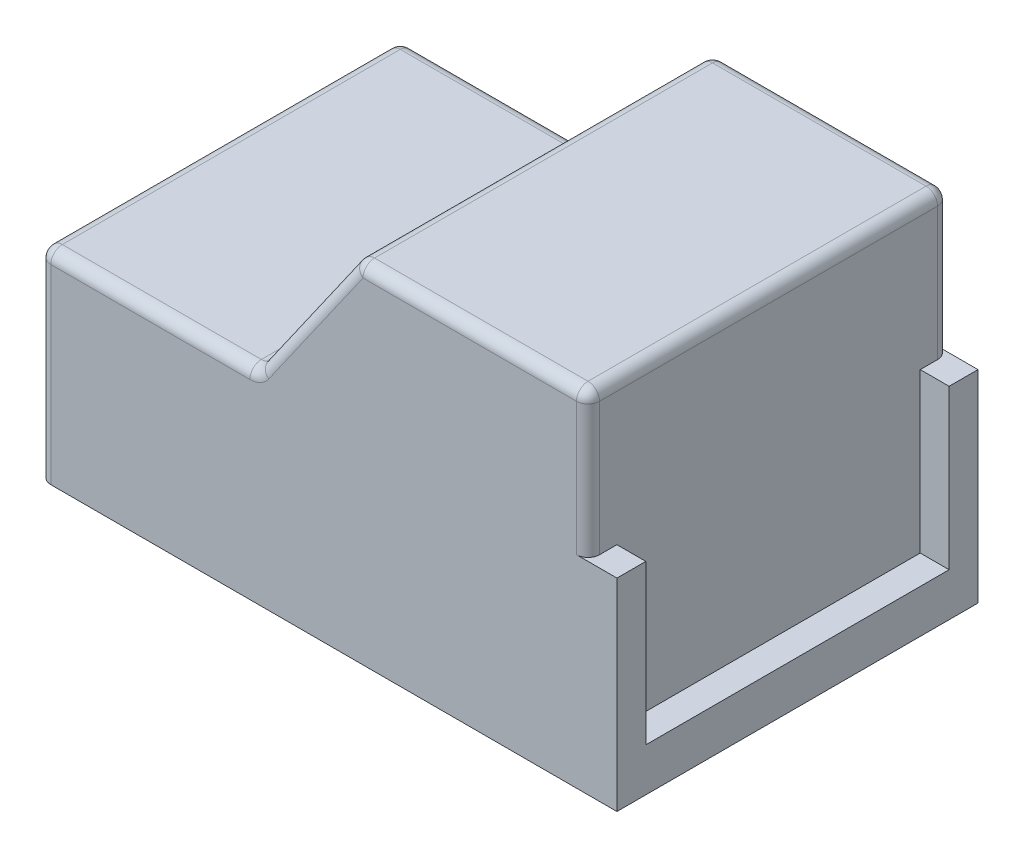
ISO-10303-21;
HEADER;
FILE_DESCRIPTION(('STEP AP214'),'2;1');
FILE_NAME('part.step','',(''),(''),'','','');
FILE_SCHEMA(('AUTOMOTIVE_DESIGN { 1 0 10303 214 1 1 1 1 }'));
ENDSEC;
DATA;
#1=APPLICATION_CONTEXT('core data for automotive mechanical design processes');
#2=APPLICATION_PROTOCOL_DEFINITION('international standard','automotive_design',2000,#1);
#3=PRODUCT_CONTEXT('',#1,'mechanical');
#4=PRODUCT('Part','Part','',(#3));
#5=PRODUCT_RELATED_PRODUCT_CATEGORY('part','',(#4));
#6=PRODUCT_DEFINITION_FORMATION('','',#4);
#7=PRODUCT_DEFINITION_CONTEXT('part definition',#1,'design');
#8=PRODUCT_DEFINITION('design','',#6,#7);
#9=PRODUCT_DEFINITION_SHAPE('','',#8);
#10=(LENGTH_UNIT() NAMED_UNIT(*) SI_UNIT(.MILLI.,.METRE.));
#11=(NAMED_UNIT(*) PLANE_ANGLE_UNIT() SI_UNIT($,.RADIAN.));
#12=(NAMED_UNIT(*) SI_UNIT($,.STERADIAN.) SOLID_ANGLE_UNIT());
#13=UNCERTAINTY_MEASURE_WITH_UNIT(LENGTH_MEASURE(1.E-05),#10,'distance_accuracy_value','');
#14=(GEOMETRIC_REPRESENTATION_CONTEXT(3) GLOBAL_UNCERTAINTY_ASSIGNED_CONTEXT((#13)) GLOBAL_UNIT_ASSIGNED_CONTEXT((#10,
#11,#12)) REPRESENTATION_CONTEXT('',''));
#15=CARTESIAN_POINT('',(0.,0.,0.));
#16=DIRECTION('',(0.,0.,1.));
#17=DIRECTION('',(1.,0.,0.));
#18=AXIS2_PLACEMENT_3D('',#15,#16,#17);
#19=CARTESIAN_POINT('',(101.6,88.9,158.75));
#20=DIRECTION('',(0.,-1.,0.));
#21=DIRECTION('',(1.,0.,0.));
#22=AXIS2_PLACEMENT_3D('',#19,#20,#21);
#23=PLANE('',#22);
#24=DIRECTION('',(0.,0.,-1.));
#25=VECTOR('',#24,1.);
#26=CARTESIAN_POINT('',(101.6,88.9,158.75));
#27=LINE('',#26,#25);
#28=CARTESIAN_POINT('',(101.6,88.9,158.75));
#29=VERTEX_POINT('',#28);
#30=CARTESIAN_POINT('',(101.6,88.8999999999999,133.35));
#31=VERTEX_POINT('',#30);
#32=EDGE_CURVE('E254',#29,#31,#27,.T.);
#33=ORIENTED_EDGE('',*,*,#32,.T.);
#34=DIRECTION('',(1.,0.,0.));
#35=VECTOR('',#34,1.);
#36=CARTESIAN_POINT('',(76.1999999999999,88.8999999999999,133.35));
#37=LINE('',#36,#35);
#38=CARTESIAN_POINT('',(76.1999999999999,88.8999999999999,133.35));
#39=VERTEX_POINT('',#38);
#40=EDGE_CURVE('E226',#39,#31,#37,.T.);
#41=ORIENTED_EDGE('',*,*,#40,.F.);
#42=DIRECTION('',(0.,0.,-1.));
#43=VECTOR('',#42,1.);
#44=CARTESIAN_POINT('',(76.1999999999999,88.8999999999999,158.75));
#45=LINE('',#44,#43);
#46=CARTESIAN_POINT('',(76.1999999999999,88.8999999999999,148.59));
#47=VERTEX_POINT('',#46);
#48=EDGE_CURVE('E252',#47,#39,#45,.T.);
#49=ORIENTED_EDGE('',*,*,#48,.F.);
#50=CARTESIAN_POINT('',(66.0399999999999,88.8999999999999,148.59));
#51=DIRECTION('',(0.,-1.,0.));
#52=DIRECTION('',(1.,0.,0.));
#53=AXIS2_PLACEMENT_3D('',#50,#51,#52);
#54=CIRCLE('',#53,10.16);
#55=CARTESIAN_POINT('',(66.0399999999999,88.8999999999999,158.75));
#56=VERTEX_POINT('',#55);
#57=EDGE_CURVE('E11',#47,#56,#54,.T.);
#58=ORIENTED_EDGE('',*,*,#57,.T.);
#59=DIRECTION('',(-1.,0.,0.));
#60=VECTOR('',#59,1.);
#61=CARTESIAN_POINT('',(101.6,88.9,158.75));
#62=LINE('',#61,#60);
#63=EDGE_CURVE('E243',#29,#56,#62,.T.);
#64=ORIENTED_EDGE('',*,*,#63,.F.);
#65=EDGE_LOOP('',(#33,#41,#49,#58,#64));
#66=FACE_BOUND('',#65,.T.);
#67=ADVANCED_FACE('F49',(#66),#23,.F.);
#68=CARTESIAN_POINT('',(-215.9,88.9,158.75));
#69=DIRECTION('',(0.,-1.,0.));
#70=DIRECTION('',(1.,0.,0.));
#71=AXIS2_PLACEMENT_3D('',#68,#69,#70);
#72=PLANE('',#71);
#73=DIRECTION('',(-1.,0.,0.));
#74=VECTOR('',#73,1.);
#75=CARTESIAN_POINT('',(-215.9,88.9,148.59));
#76=LINE('',#75,#74);
#77=CARTESIAN_POINT('',(-396.24,88.9,148.59));
#78=VERTEX_POINT('',#77);
#79=CARTESIAN_POINT('',(-221.188961233606,88.9,148.59));
#80=VERTEX_POINT('',#79);
#81=EDGE_CURVE('E304',#78,#80,#76,.F.);
#82=ORIENTED_EDGE('',*,*,#81,.T.);
#83=DIRECTION('',(0.,0.,-1.));
#84=VECTOR('',#83,1.);
#85=CARTESIAN_POINT('',(-221.188961233606,88.9,-158.75));
#86=LINE('',#85,#84);
#87=CARTESIAN_POINT('',(-221.188961233606,88.9,-148.59));
#88=VERTEX_POINT('',#87);
#89=EDGE_CURVE('E306',#80,#88,#86,.T.);
#90=ORIENTED_EDGE('',*,*,#89,.T.);
#91=DIRECTION('',(-1.,0.,0.));
#92=VECTOR('',#91,1.);
#93=CARTESIAN_POINT('',(-215.9,88.9,-148.59));
#94=LINE('',#93,#92);
#95=CARTESIAN_POINT('',(-396.24,88.9,-148.59));
#96=VERTEX_POINT('',#95);
#97=EDGE_CURVE('E300',#88,#96,#94,.T.);
#98=ORIENTED_EDGE('',*,*,#97,.T.);
#99=DIRECTION('',(0.,0.,-1.));
#100=VECTOR('',#99,1.);
#101=CARTESIAN_POINT('',(-396.24,88.9,158.75));
#102=LINE('',#101,#100);
#103=EDGE_CURVE('E302',#96,#78,#102,.F.);
#104=ORIENTED_EDGE('',*,*,#103,.T.);
#105=EDGE_LOOP('',(#82,#90,#98,#104));
#106=FACE_BOUND('',#105,.T.);
#107=ADVANCED_FACE('F507',(#106),#72,.F.);
#108=CARTESIAN_POINT('',(-406.4,88.9,158.75));
#109=DIRECTION('',(1.,0.,0.));
#110=DIRECTION('',(0.,0.,-1.));
#111=AXIS2_PLACEMENT_3D('',#108,#109,#110);
#112=PLANE('',#111);
#113=DIRECTION('',(0.,0.,-1.));
#114=VECTOR('',#113,1.);
#115=CARTESIAN_POINT('',(-406.4,78.74,158.75));
#116=LINE('',#115,#114);
#117=CARTESIAN_POINT('',(-406.4,78.74,148.59));
#118=VERTEX_POINT('',#117);
#119=CARTESIAN_POINT('',(-406.4,78.74,-148.59));
#120=VERTEX_POINT('',#119);
#121=EDGE_CURVE('E311',#118,#120,#116,.T.);
#122=ORIENTED_EDGE('',*,*,#121,.T.);
#123=DIRECTION('',(0.,-1.,0.));
#124=VECTOR('',#123,1.);
#125=CARTESIAN_POINT('',(-406.4,88.9,-148.59));
#126=LINE('',#125,#124);
#127=CARTESIAN_POINT('',(-406.4,-88.9,-148.59));
#128=VERTEX_POINT('',#127);
#129=EDGE_CURVE('E313',#120,#128,#126,.T.);
#130=ORIENTED_EDGE('',*,*,#129,.T.);
#131=DIRECTION('',(0.,0.,-1.));
#132=VECTOR('',#131,1.);
#133=CARTESIAN_POINT('',(-406.4,-88.9,158.75));
#134=LINE('',#133,#132);
#135=CARTESIAN_POINT('',(-406.4,-88.9,148.59));
#136=VERTEX_POINT('',#135);
#137=EDGE_CURVE('E260',#136,#128,#134,.T.);
#138=ORIENTED_EDGE('',*,*,#137,.F.);
#139=DIRECTION('',(0.,-1.,0.));
#140=VECTOR('',#139,1.);
#141=CARTESIAN_POINT('',(-406.4,88.9,148.59));
#142=LINE('',#141,#140);
#143=EDGE_CURVE('E309',#136,#118,#142,.F.);
#144=ORIENTED_EDGE('',*,*,#143,.T.);
#145=EDGE_LOOP('',(#122,#130,#138,#144));
#146=FACE_BOUND('',#145,.T.);
#147=ADVANCED_FACE('F511',(#146),#112,.F.);
#148=CARTESIAN_POINT('',(-406.4,-88.9,158.75));
#149=DIRECTION('',(0.,1.,0.));
#150=DIRECTION('',(0.,0.,1.));
#151=AXIS2_PLACEMENT_3D('',#148,#149,#150);
#152=PLANE('',#151);
#153=ORIENTED_EDGE('',*,*,#137,.T.);
#154=CARTESIAN_POINT('',(-396.24,-88.9,-148.59));
#155=DIRECTION('',(0.,1.,0.));
#156=DIRECTION('',(0.,0.,1.));
#157=AXIS2_PLACEMENT_3D('',#154,#155,#156);
#158=CIRCLE('',#157,10.16);
#159=CARTESIAN_POINT('',(-396.24,-88.9,-158.75));
#160=VERTEX_POINT('',#159);
#161=EDGE_CURVE('E330',#128,#160,#158,.F.);
#162=ORIENTED_EDGE('',*,*,#161,.T.);
#163=DIRECTION('',(1.,0.,0.));
#164=VECTOR('',#163,1.);
#165=CARTESIAN_POINT('',(-406.4,-88.9,-158.75));
#166=LINE('',#165,#164);
#167=CARTESIAN_POINT('',(101.6,-88.9,-158.75));
#168=VERTEX_POINT('',#167);
#169=EDGE_CURVE('E246',#160,#168,#166,.T.);
#170=ORIENTED_EDGE('',*,*,#169,.T.);
#171=DIRECTION('',(0.,0.,-1.));
#172=VECTOR('',#171,1.);
#173=CARTESIAN_POINT('',(101.6,-88.9,158.75));
#174=LINE('',#173,#172);
#175=CARTESIAN_POINT('',(101.6,-88.9,158.75));
#176=VERTEX_POINT('',#175);
#177=EDGE_CURVE('E257',#176,#168,#174,.T.);
#178=ORIENTED_EDGE('',*,*,#177,.F.);
#179=DIRECTION('',(1.,0.,0.));
#180=VECTOR('',#179,1.);
#181=CARTESIAN_POINT('',(-406.4,-88.9,158.75));
#182=LINE('',#181,#180);
#183=CARTESIAN_POINT('',(-396.24,-88.9,158.75));
#184=VERTEX_POINT('',#183);
#185=EDGE_CURVE('E238',#184,#176,#182,.T.);
#186=ORIENTED_EDGE('',*,*,#185,.F.);
#187=CARTESIAN_POINT('',(-396.24,-88.9,148.59));
#188=DIRECTION('',(0.,1.,0.));
#189=DIRECTION('',(0.,0.,1.));
#190=AXIS2_PLACEMENT_3D('',#187,#188,#189);
#191=CIRCLE('',#190,10.16);
#192=EDGE_CURVE('E328',#184,#136,#191,.F.);
#193=ORIENTED_EDGE('',*,*,#192,.T.);
#194=EDGE_LOOP('',(#153,#162,#170,#178,#186,#193));
#195=FACE_BOUND('',#194,.T.);
#196=ADVANCED_FACE('F428',(#195),#152,.F.);
#197=CARTESIAN_POINT('',(101.6,-88.9,158.75));
#198=DIRECTION('',(-1.,0.,0.));
#199=DIRECTION('',(0.,0.,1.));
#200=AXIS2_PLACEMENT_3D('',#197,#198,#199);
#201=PLANE('',#200);
#202=DIRECTION('',(0.,0.,-1.));
#203=VECTOR('',#202,1.);
#204=CARTESIAN_POINT('',(101.6,-50.8000000000001,133.35));
#205=LINE('',#204,#203);
#206=CARTESIAN_POINT('',(101.6,-50.8000000000001,133.35));
#207=VERTEX_POINT('',#206);
#208=CARTESIAN_POINT('',(101.6,-50.8000000000001,-133.35));
#209=VERTEX_POINT('',#208);
#210=EDGE_CURVE('E217',#207,#209,#205,.T.);
#211=ORIENTED_EDGE('',*,*,#210,.F.);
#212=DIRECTION('',(0.,1.,0.));
#213=VECTOR('',#212,1.);
#214=CARTESIAN_POINT('',(101.6,-50.8000000000001,133.35));
#215=LINE('',#214,#213);
#216=EDGE_CURVE('E249',#207,#31,#215,.T.);
#217=ORIENTED_EDGE('',*,*,#216,.T.);
#218=ORIENTED_EDGE('',*,*,#32,.F.);
#219=DIRECTION('',(0.,1.,0.));
#220=VECTOR('',#219,1.);
#221=CARTESIAN_POINT('',(101.6,-88.9,158.75));
#222=LINE('',#221,#220);
#223=EDGE_CURVE('E240',#176,#29,#222,.T.);
#224=ORIENTED_EDGE('',*,*,#223,.F.);
#225=ORIENTED_EDGE('',*,*,#177,.T.);
#226=DIRECTION('',(0.,1.,0.));
#227=VECTOR('',#226,1.);
#228=CARTESIAN_POINT('',(101.6,-88.9,-158.75));
#229=LINE('',#228,#227);
#230=CARTESIAN_POINT('',(101.6,88.9,-158.75));
#231=VERTEX_POINT('',#230);
#232=EDGE_CURVE('E248',#168,#231,#229,.T.);
#233=ORIENTED_EDGE('',*,*,#232,.T.);
#234=CARTESIAN_POINT('',(101.6,88.8999999999999,-133.35));
#235=VERTEX_POINT('',#234);
#236=EDGE_CURVE('E231',#235,#231,#27,.T.);
#237=ORIENTED_EDGE('',*,*,#236,.F.);
#238=DIRECTION('',(0.,1.,0.));
#239=VECTOR('',#238,1.);
#240=CARTESIAN_POINT('',(101.6,-50.8000000000001,-133.35));
#241=LINE('',#240,#239);
#242=EDGE_CURVE('E209',#209,#235,#241,.T.);
#243=ORIENTED_EDGE('',*,*,#242,.F.);
#244=EDGE_LOOP('',(#211,#217,#218,#224,#225,#233,#237,#243));
#245=FACE_BOUND('',#244,.T.);
#246=ADVANCED_FACE('F229',(#245),#201,.F.);
#247=CARTESIAN_POINT('',(76.1999999999999,88.8999999999999,-133.35));
#248=VERTEX_POINT('',#247);
#249=CARTESIAN_POINT('',(76.1999999999999,88.8999999999999,-148.59));
#250=VERTEX_POINT('',#249);
#251=EDGE_CURVE('E245',#248,#250,#45,.T.);
#252=ORIENTED_EDGE('',*,*,#251,.F.);
#253=DIRECTION('',(-1.,0.,0.));
#254=VECTOR('',#253,1.);
#255=CARTESIAN_POINT('',(76.1999999999999,88.8999999999999,-133.35));
#256=LINE('',#255,#254);
#257=EDGE_CURVE('E402',#235,#248,#256,.T.);
#258=ORIENTED_EDGE('',*,*,#257,.F.);
#259=ORIENTED_EDGE('',*,*,#236,.T.);
#260=DIRECTION('',(-1.,0.,0.));
#261=VECTOR('',#260,1.);
#262=CARTESIAN_POINT('',(101.6,88.9,-158.75));
#263=LINE('',#262,#261);
#264=CARTESIAN_POINT('',(66.0399999999999,88.8999999999999,-158.75));
#265=VERTEX_POINT('',#264);
#266=EDGE_CURVE('E241',#231,#265,#263,.T.);
#267=ORIENTED_EDGE('',*,*,#266,.T.);
#268=CARTESIAN_POINT('',(66.0399999999999,88.8999999999999,-148.59));
#269=DIRECTION('',(0.,-1.,0.));
#270=DIRECTION('',(1.,0.,0.));
#271=AXIS2_PLACEMENT_3D('',#268,#269,#270);
#272=CIRCLE('',#271,10.16);
#273=EDGE_CURVE('E58',#265,#250,#272,.T.);
#274=ORIENTED_EDGE('',*,*,#273,.T.);
#275=EDGE_LOOP('',(#252,#258,#259,#267,#274));
#276=FACE_BOUND('',#275,.T.);
#277=ADVANCED_FACE('F496',(#276),#23,.F.);
#278=CARTESIAN_POINT('',(76.1999999999999,88.8999999999999,158.75));
#279=DIRECTION('',(-1.,0.,0.));
#280=DIRECTION('',(0.,0.,1.));
#281=AXIS2_PLACEMENT_3D('',#278,#279,#280);
#282=PLANE('',#281);
#283=ORIENTED_EDGE('',*,*,#251,.T.);
#284=DIRECTION('',(0.,1.,0.));
#285=VECTOR('',#284,1.);
#286=CARTESIAN_POINT('',(76.1999999999999,88.8999999999999,-148.59));
#287=LINE('',#286,#285);
#288=CARTESIAN_POINT('',(76.1999999999999,205.74,-148.59));
#289=VERTEX_POINT('',#288);
#290=EDGE_CURVE('E66',#250,#289,#287,.T.);
#291=ORIENTED_EDGE('',*,*,#290,.T.);
#292=DIRECTION('',(0.,0.,-1.));
#293=VECTOR('',#292,1.);
#294=CARTESIAN_POINT('',(76.1999999999999,205.74,158.75));
#295=LINE('',#294,#293);
#296=CARTESIAN_POINT('',(76.1999999999999,205.74,148.59));
#297=VERTEX_POINT('',#296);
#298=EDGE_CURVE('E71',#289,#297,#295,.F.);
#299=ORIENTED_EDGE('',*,*,#298,.T.);
#300=DIRECTION('',(0.,1.,0.));
#301=VECTOR('',#300,1.);
#302=CARTESIAN_POINT('',(76.1999999999999,88.8999999999999,148.59));
#303=LINE('',#302,#301);
#304=EDGE_CURVE('E324',#297,#47,#303,.F.);
#305=ORIENTED_EDGE('',*,*,#304,.T.);
#306=ORIENTED_EDGE('',*,*,#48,.T.);
#307=DIRECTION('',(0.,1.,0.));
#308=VECTOR('',#307,1.);
#309=CARTESIAN_POINT('',(76.2,-50.8000000000001,133.35));
#310=LINE('',#309,#308);
#311=CARTESIAN_POINT('',(76.2,-50.8000000000001,133.35));
#312=VERTEX_POINT('',#311);
#313=EDGE_CURVE('E233',#312,#39,#310,.T.);
#314=ORIENTED_EDGE('',*,*,#313,.F.);
#315=DIRECTION('',(0.,0.,1.));
#316=VECTOR('',#315,1.);
#317=CARTESIAN_POINT('',(76.2,-50.8000000000001,133.35));
#318=LINE('',#317,#316);
#319=CARTESIAN_POINT('',(76.2,-50.8000000000001,-133.35));
#320=VERTEX_POINT('',#319);
#321=EDGE_CURVE('E216',#320,#312,#318,.T.);
#322=ORIENTED_EDGE('',*,*,#321,.F.);
#323=DIRECTION('',(0.,1.,0.));
#324=VECTOR('',#323,1.);
#325=CARTESIAN_POINT('',(76.2,-50.8000000000001,-133.35));
#326=LINE('',#325,#324);
#327=EDGE_CURVE('E212',#320,#248,#326,.T.);
#328=ORIENTED_EDGE('',*,*,#327,.T.);
#329=EDGE_LOOP('',(#283,#291,#299,#305,#306,#314,#322,#328));
#330=FACE_BOUND('',#329,.T.);
#331=ADVANCED_FACE('F497',(#330),#282,.F.);
#332=CARTESIAN_POINT('',(76.1999999999999,215.9,158.75));
#333=DIRECTION('',(0.,-1.,0.));
#334=DIRECTION('',(1.,0.,0.));
#335=AXIS2_PLACEMENT_3D('',#332,#333,#334);
#336=PLANE('',#335);
#337=DIRECTION('',(0.,0.,-1.));
#338=VECTOR('',#337,1.);
#339=CARTESIAN_POINT('',(66.0399999999999,215.9,158.75));
#340=LINE('',#339,#338);
#341=CARTESIAN_POINT('',(66.0399999999999,215.9,148.59));
#342=VERTEX_POINT('',#341);
#343=CARTESIAN_POINT('',(66.0399999999999,215.9,-148.59));
#344=VERTEX_POINT('',#343);
#345=EDGE_CURVE('E319',#342,#344,#340,.T.);
#346=ORIENTED_EDGE('',*,*,#345,.T.);
#347=DIRECTION('',(-1.,0.,0.));
#348=VECTOR('',#347,1.);
#349=CARTESIAN_POINT('',(76.1999999999999,215.9,-148.59));
#350=LINE('',#349,#348);
#351=CARTESIAN_POINT('',(-121.684681413762,215.9,-148.59));
#352=VERTEX_POINT('',#351);
#353=EDGE_CURVE('E322',#344,#352,#350,.T.);
#354=ORIENTED_EDGE('',*,*,#353,.T.);
#355=DIRECTION('',(0.,0.,-1.));
#356=VECTOR('',#355,1.);
#357=CARTESIAN_POINT('',(-121.684681413762,215.9,158.75));
#358=LINE('',#357,#356);
#359=CARTESIAN_POINT('',(-121.684681413762,215.9,148.59));
#360=VERTEX_POINT('',#359);
#361=EDGE_CURVE('E317',#352,#360,#358,.F.);
#362=ORIENTED_EDGE('',*,*,#361,.T.);
#363=DIRECTION('',(-1.,0.,0.));
#364=VECTOR('',#363,1.);
#365=CARTESIAN_POINT('',(76.1999999999999,215.9,148.59));
#366=LINE('',#365,#364);
#367=EDGE_CURVE('E315',#360,#342,#366,.F.);
#368=ORIENTED_EDGE('',*,*,#367,.T.);
#369=EDGE_LOOP('',(#346,#354,#362,#368));
#370=FACE_BOUND('',#369,.T.);
#371=ADVANCED_FACE('F474',(#370),#336,.F.);
#372=CARTESIAN_POINT('',(-126.973642647368,215.9,158.75));
#373=DIRECTION('',(0.819152044288994,-0.573576436351043,0.));
#374=DIRECTION('',(0.573576436351043,0.819152044288994,0.));
#375=AXIS2_PLACEMENT_3D('',#372,#373,#374);
#376=PLANE('',#375);
#377=DIRECTION('',(-0.573576436351043,-0.819152044288994,0.));
#378=VECTOR('',#377,1.);
#379=CARTESIAN_POINT('',(-126.973642647368,215.9,-148.59));
#380=LINE('',#379,#378);
#381=CARTESIAN_POINT('',(-130.007266183738,211.567536593327,-148.59));
#382=VERTEX_POINT('',#381);
#383=CARTESIAN_POINT('',(-212.86637646363,93.2324634066734,-148.59));
#384=VERTEX_POINT('',#383);
#385=EDGE_CURVE('E279',#382,#384,#380,.T.);
#386=ORIENTED_EDGE('',*,*,#385,.T.);
#387=DIRECTION('',(0.,0.,-1.));
#388=VECTOR('',#387,1.);
#389=CARTESIAN_POINT('',(-212.86637646363,93.2324634066734,158.75));
#390=LINE('',#389,#388);
#391=CARTESIAN_POINT('',(-212.86637646363,93.2324634066734,148.59));
#392=VERTEX_POINT('',#391);
#393=EDGE_CURVE('E284',#384,#392,#390,.F.);
#394=ORIENTED_EDGE('',*,*,#393,.T.);
#395=DIRECTION('',(-0.573576436351043,-0.819152044288994,0.));
#396=VECTOR('',#395,1.);
#397=CARTESIAN_POINT('',(-126.973642647368,215.9,148.59));
#398=LINE('',#397,#396);
#399=CARTESIAN_POINT('',(-130.007266183738,211.567536593327,148.59));
#400=VERTEX_POINT('',#399);
#401=EDGE_CURVE('E281',#392,#400,#398,.F.);
#402=ORIENTED_EDGE('',*,*,#401,.T.);
#403=DIRECTION('',(0.,0.,-1.));
#404=VECTOR('',#403,1.);
#405=CARTESIAN_POINT('',(-130.007266183738,211.567536593327,158.75));
#406=LINE('',#405,#404);
#407=EDGE_CURVE('E277',#400,#382,#406,.T.);
#408=ORIENTED_EDGE('',*,*,#407,.T.);
#409=EDGE_LOOP('',(#386,#394,#402,#408));
#410=FACE_BOUND('',#409,.T.);
#411=ADVANCED_FACE('F462',(#410),#376,.F.);
#412=CARTESIAN_POINT('',(0.,0.,158.75));
#413=DIRECTION('',(0.,0.,1.));
#414=DIRECTION('',(1.,0.,0.));
#415=AXIS2_PLACEMENT_3D('',#412,#413,#414);
#416=PLANE('',#415);
#417=DIRECTION('',(-1.,0.,0.));
#418=VECTOR('',#417,1.);
#419=CARTESIAN_POINT('',(-406.4,78.74,158.75));
#420=LINE('',#419,#418);
#421=CARTESIAN_POINT('',(-221.188961233606,78.74,158.75));
#422=VERTEX_POINT('',#421);
#423=CARTESIAN_POINT('',(-396.24,78.74,158.75));
#424=VERTEX_POINT('',#423);
#425=EDGE_CURVE('E273',#422,#424,#420,.T.);
#426=ORIENTED_EDGE('',*,*,#425,.T.);
#427=DIRECTION('',(0.,-1.,0.));
#428=VECTOR('',#427,1.);
#429=CARTESIAN_POINT('',(-396.24,-88.9,158.75));
#430=LINE('',#429,#428);
#431=EDGE_CURVE('E275',#424,#184,#430,.T.);
#432=ORIENTED_EDGE('',*,*,#431,.T.);
#433=ORIENTED_EDGE('',*,*,#185,.T.);
#434=ORIENTED_EDGE('',*,*,#223,.T.);
#435=ORIENTED_EDGE('',*,*,#63,.T.);
#436=DIRECTION('',(0.,1.,0.));
#437=VECTOR('',#436,1.);
#438=CARTESIAN_POINT('',(66.0399999999999,215.9,158.75));
#439=LINE('',#438,#437);
#440=CARTESIAN_POINT('',(66.0399999999999,205.74,158.75));
#441=VERTEX_POINT('',#440);
#442=EDGE_CURVE('E265',#56,#441,#439,.T.);
#443=ORIENTED_EDGE('',*,*,#442,.T.);
#444=DIRECTION('',(-1.,0.,0.));
#445=VECTOR('',#444,1.);
#446=CARTESIAN_POINT('',(-126.973642647368,205.74,158.75));
#447=LINE('',#446,#445);
#448=CARTESIAN_POINT('',(-121.684681413762,205.74,158.75));
#449=VERTEX_POINT('',#448);
#450=EDGE_CURVE('E263',#441,#449,#447,.T.);
#451=ORIENTED_EDGE('',*,*,#450,.T.);
#452=DIRECTION('',(-0.573576436351043,-0.819152044288994,0.));
#453=VECTOR('',#452,1.);
#454=CARTESIAN_POINT('',(-207.577415230024,83.0724634066734,158.75));
#455=LINE('',#454,#453);
#456=CARTESIAN_POINT('',(-204.543791693653,87.4049268133468,158.75));
#457=VERTEX_POINT('',#456);
#458=EDGE_CURVE('E267',#449,#457,#455,.T.);
#459=ORIENTED_EDGE('',*,*,#458,.T.);
#460=CARTESIAN_POINT('',(-221.188961233606,99.06,158.75));
#461=DIRECTION('',(0.,0.,1.));
#462=DIRECTION('',(1.,0.,0.));
#463=AXIS2_PLACEMENT_3D('',#460,#461,#462);
#464=CIRCLE('',#463,20.32);
#465=EDGE_CURVE('E270',#422,#457,#464,.T.);
#466=ORIENTED_EDGE('',*,*,#465,.F.);
#467=EDGE_LOOP('',(#426,#432,#433,#434,#435,#443,#451,#459,#466));
#468=FACE_BOUND('',#467,.T.);
#469=ADVANCED_FACE('F423',(#468),#416,.T.);
#470=CARTESIAN_POINT('',(0.,0.,-158.75));
#471=DIRECTION('',(0.,0.,1.));
#472=DIRECTION('',(1.,0.,0.));
#473=AXIS2_PLACEMENT_3D('',#470,#471,#472);
#474=PLANE('',#473);
#475=ORIENTED_EDGE('',*,*,#169,.F.);
#476=DIRECTION('',(0.,-1.,0.));
#477=VECTOR('',#476,1.);
#478=CARTESIAN_POINT('',(-396.24,0.,-158.75));
#479=LINE('',#478,#477);
#480=CARTESIAN_POINT('',(-396.24,78.74,-158.75));
#481=VERTEX_POINT('',#480);
#482=EDGE_CURVE('E298',#160,#481,#479,.F.);
#483=ORIENTED_EDGE('',*,*,#482,.T.);
#484=DIRECTION('',(-1.,0.,0.));
#485=VECTOR('',#484,1.);
#486=CARTESIAN_POINT('',(0.,78.7400000000001,-158.75));
#487=LINE('',#486,#485);
#488=CARTESIAN_POINT('',(-221.188961233606,78.74,-158.75));
#489=VERTEX_POINT('',#488);
#490=EDGE_CURVE('E296',#481,#489,#487,.F.);
#491=ORIENTED_EDGE('',*,*,#490,.T.);
#492=CARTESIAN_POINT('',(-221.188961233606,99.06,-158.75));
#493=DIRECTION('',(0.,0.,1.));
#494=DIRECTION('',(1.,0.,0.));
#495=AXIS2_PLACEMENT_3D('',#492,#493,#494);
#496=CIRCLE('',#495,20.32);
#497=CARTESIAN_POINT('',(-204.543791693653,87.4049268133468,-158.75));
#498=VERTEX_POINT('',#497);
#499=EDGE_CURVE('E293',#498,#489,#496,.F.);
#500=ORIENTED_EDGE('',*,*,#499,.F.);
#501=DIRECTION('',(-0.573576436351043,-0.819152044288994,0.));
#502=VECTOR('',#501,1.);
#503=CARTESIAN_POINT('',(-178.317826695964,124.859486449686,-158.75));
#504=LINE('',#503,#502);
#505=CARTESIAN_POINT('',(-121.684681413762,205.74,-158.75));
#506=VERTEX_POINT('',#505);
#507=EDGE_CURVE('E291',#498,#506,#504,.F.);
#508=ORIENTED_EDGE('',*,*,#507,.T.);
#509=DIRECTION('',(-1.,0.,0.));
#510=VECTOR('',#509,1.);
#511=CARTESIAN_POINT('',(0.,205.74,-158.75));
#512=LINE('',#511,#510);
#513=CARTESIAN_POINT('',(66.0399999999999,205.74,-158.75));
#514=VERTEX_POINT('',#513);
#515=EDGE_CURVE('E286',#506,#514,#512,.F.);
#516=ORIENTED_EDGE('',*,*,#515,.T.);
#517=DIRECTION('',(0.,1.,0.));
#518=VECTOR('',#517,1.);
#519=CARTESIAN_POINT('',(66.0399999999999,0.,-158.75));
#520=LINE('',#519,#518);
#521=EDGE_CURVE('E288',#514,#265,#520,.F.);
#522=ORIENTED_EDGE('',*,*,#521,.T.);
#523=ORIENTED_EDGE('',*,*,#266,.F.);
#524=ORIENTED_EDGE('',*,*,#232,.F.);
#525=EDGE_LOOP('',(#475,#483,#491,#500,#508,#516,#522,#523,#524));
#526=FACE_BOUND('',#525,.T.);
#527=ADVANCED_FACE('F433',(#526),#474,.F.);
#528=CARTESIAN_POINT('',(76.2,-50.8000000000001,133.35));
#529=DIRECTION('',(0.,0.,1.));
#530=DIRECTION('',(1.,0.,0.));
#531=AXIS2_PLACEMENT_3D('',#528,#529,#530);
#532=PLANE('',#531);
#533=ORIENTED_EDGE('',*,*,#40,.T.);
#534=ORIENTED_EDGE('',*,*,#216,.F.);
#535=DIRECTION('',(1.,0.,0.));
#536=VECTOR('',#535,1.);
#537=CARTESIAN_POINT('',(76.2,-50.8000000000001,133.35));
#538=LINE('',#537,#536);
#539=EDGE_CURVE('E223',#312,#207,#538,.T.);
#540=ORIENTED_EDGE('',*,*,#539,.F.);
#541=ORIENTED_EDGE('',*,*,#313,.T.);
#542=EDGE_LOOP('',(#533,#534,#540,#541));
#543=FACE_BOUND('',#542,.T.);
#544=ADVANCED_FACE('F413',(#543),#532,.F.);
#545=CARTESIAN_POINT('',(76.2,-50.8000000000001,-133.35));
#546=DIRECTION('',(0.,0.,-1.));
#547=DIRECTION('',(-1.,0.,0.));
#548=AXIS2_PLACEMENT_3D('',#545,#546,#547);
#549=PLANE('',#548);
#550=ORIENTED_EDGE('',*,*,#257,.T.);
#551=ORIENTED_EDGE('',*,*,#327,.F.);
#552=DIRECTION('',(-1.,0.,0.));
#553=VECTOR('',#552,1.);
#554=CARTESIAN_POINT('',(76.2,-50.8000000000001,-133.35));
#555=LINE('',#554,#553);
#556=EDGE_CURVE('E205',#209,#320,#555,.T.);
#557=ORIENTED_EDGE('',*,*,#556,.F.);
#558=ORIENTED_EDGE('',*,*,#242,.T.);
#559=EDGE_LOOP('',(#550,#551,#557,#558));
#560=FACE_BOUND('',#559,.T.);
#561=ADVANCED_FACE('F207',(#560),#549,.F.);
#562=CARTESIAN_POINT('',(0.,-50.8000000000001,0.));
#563=DIRECTION('',(0.,-1.,0.));
#564=DIRECTION('',(1.,0.,0.));
#565=AXIS2_PLACEMENT_3D('',#562,#563,#564);
#566=PLANE('',#565);
#567=ORIENTED_EDGE('',*,*,#210,.T.);
#568=ORIENTED_EDGE('',*,*,#556,.T.);
#569=ORIENTED_EDGE('',*,*,#321,.T.);
#570=ORIENTED_EDGE('',*,*,#539,.T.);
#571=EDGE_LOOP('',(#567,#568,#569,#570));
#572=FACE_BOUND('',#571,.T.);
#573=ADVANCED_FACE('F221',(#572),#566,.F.);
#574=CARTESIAN_POINT('',(66.0399999999999,88.8999999999999,-148.59));
#575=DIRECTION('',(0.,1.,0.));
#576=DIRECTION('',(0.,0.,1.));
#577=AXIS2_PLACEMENT_3D('',#574,#575,#576);
#578=CYLINDRICAL_SURFACE('',#577,10.16);
#579=ORIENTED_EDGE('',*,*,#273,.F.);
#580=ORIENTED_EDGE('',*,*,#521,.F.);
#581=CARTESIAN_POINT('',(66.0399999999999,205.74,-148.59));
#582=DIRECTION('',(0.,1.,0.));
#583=DIRECTION('',(0.,0.,1.));
#584=AXIS2_PLACEMENT_3D('',#581,#582,#583);
#585=CIRCLE('',#584,10.16);
#586=EDGE_CURVE('E53',#289,#514,#585,.T.);
#587=ORIENTED_EDGE('',*,*,#586,.F.);
#588=ORIENTED_EDGE('',*,*,#290,.F.);
#589=EDGE_LOOP('',(#579,#580,#587,#588));
#590=FACE_BOUND('',#589,.T.);
#591=ADVANCED_FACE('F51',(#590),#578,.T.);
#592=CARTESIAN_POINT('',(-396.24,88.9,-148.59));
#593=DIRECTION('',(0.,-1.,0.));
#594=DIRECTION('',(0.,0.,-1.));
#595=AXIS2_PLACEMENT_3D('',#592,#593,#594);
#596=CYLINDRICAL_SURFACE('',#595,10.16);
#597=ORIENTED_EDGE('',*,*,#161,.F.);
#598=ORIENTED_EDGE('',*,*,#129,.F.);
#599=CARTESIAN_POINT('',(-396.24,78.74,-148.59));
#600=DIRECTION('',(0.,1.,0.));
#601=DIRECTION('',(0.,0.,1.));
#602=AXIS2_PLACEMENT_3D('',#599,#600,#601);
#603=CIRCLE('',#602,10.16);
#604=EDGE_CURVE('E395',#481,#120,#603,.T.);
#605=ORIENTED_EDGE('',*,*,#604,.F.);
#606=ORIENTED_EDGE('',*,*,#482,.F.);
#607=EDGE_LOOP('',(#597,#598,#605,#606));
#608=FACE_BOUND('',#607,.T.);
#609=ADVANCED_FACE('F436',(#608),#596,.T.);
#610=CARTESIAN_POINT('',(66.0399999999999,205.74,-148.59));
#611=DIRECTION('',(0.,0.,-1.));
#612=DIRECTION('',(-1.,0.,0.));
#613=AXIS2_PLACEMENT_3D('',#610,#611,#612);
#614=SPHERICAL_SURFACE('',#613,10.16);
#615=CARTESIAN_POINT('',(66.0399999999999,205.74,-148.59));
#616=DIRECTION('',(0.,0.,-1.));
#617=DIRECTION('',(-1.,0.,0.));
#618=AXIS2_PLACEMENT_3D('',#615,#616,#617);
#619=CIRCLE('',#618,10.16);
#620=EDGE_CURVE('E390',#289,#344,#619,.F.);
#621=ORIENTED_EDGE('',*,*,#620,.F.);
#622=ORIENTED_EDGE('',*,*,#586,.T.);
#623=CARTESIAN_POINT('',(66.0399999999999,205.74,-148.59));
#624=DIRECTION('',(1.,0.,0.));
#625=DIRECTION('',(0.,0.,-1.));
#626=AXIS2_PLACEMENT_3D('',#623,#624,#625);
#627=CIRCLE('',#626,10.16);
#628=EDGE_CURVE('E393',#344,#514,#627,.F.);
#629=ORIENTED_EDGE('',*,*,#628,.F.);
#630=EDGE_LOOP('',(#621,#622,#629));
#631=FACE_BOUND('',#630,.T.);
#632=ADVANCED_FACE('F488',(#631),#614,.T.);
#633=CARTESIAN_POINT('',(-396.24,78.74,-148.59));
#634=DIRECTION('',(-1.,0.,0.));
#635=DIRECTION('',(0.,0.,1.));
#636=AXIS2_PLACEMENT_3D('',#633,#634,#635);
#637=SPHERICAL_SURFACE('',#636,10.16);
#638=CARTESIAN_POINT('',(-396.24,78.74,-148.59));
#639=DIRECTION('',(-1.,0.,0.));
#640=DIRECTION('',(0.,0.,1.));
#641=AXIS2_PLACEMENT_3D('',#638,#639,#640);
#642=CIRCLE('',#641,10.16);
#643=EDGE_CURVE('E384',#481,#96,#642,.F.);
#644=ORIENTED_EDGE('',*,*,#643,.F.);
#645=ORIENTED_EDGE('',*,*,#604,.T.);
#646=CARTESIAN_POINT('',(-396.24,78.74,-148.59));
#647=DIRECTION('',(0.,0.,-1.));
#648=DIRECTION('',(-1.,0.,0.));
#649=AXIS2_PLACEMENT_3D('',#646,#647,#648);
#650=CIRCLE('',#649,10.16);
#651=EDGE_CURVE('E387',#96,#120,#650,.F.);
#652=ORIENTED_EDGE('',*,*,#651,.F.);
#653=EDGE_LOOP('',(#644,#645,#652));
#654=FACE_BOUND('',#653,.T.);
#655=ADVANCED_FACE('F439',(#654),#637,.T.);
#656=CARTESIAN_POINT('',(76.1999999999999,205.74,-148.59));
#657=DIRECTION('',(-1.,0.,0.));
#658=DIRECTION('',(0.,-1.,0.));
#659=AXIS2_PLACEMENT_3D('',#656,#657,#658);
#660=CYLINDRICAL_SURFACE('',#659,10.16);
#661=ORIENTED_EDGE('',*,*,#628,.T.);
#662=ORIENTED_EDGE('',*,*,#515,.F.);
#663=CARTESIAN_POINT('',(-121.684681413762,205.74,-148.59));
#664=DIRECTION('',(-1.,0.,0.));
#665=DIRECTION('',(0.,0.,1.));
#666=AXIS2_PLACEMENT_3D('',#663,#664,#665);
#667=CIRCLE('',#666,10.16);
#668=EDGE_CURVE('E378',#352,#506,#667,.T.);
#669=ORIENTED_EDGE('',*,*,#668,.F.);
#670=ORIENTED_EDGE('',*,*,#353,.F.);
#671=EDGE_LOOP('',(#661,#662,#669,#670));
#672=FACE_BOUND('',#671,.T.);
#673=ADVANCED_FACE('F490',(#672),#660,.T.);
#674=CARTESIAN_POINT('',(66.0399999999999,205.74,158.75));
#675=DIRECTION('',(0.,0.,-1.));
#676=DIRECTION('',(-1.,0.,0.));
#677=AXIS2_PLACEMENT_3D('',#674,#675,#676);
#678=CYLINDRICAL_SURFACE('',#677,10.16);
#679=ORIENTED_EDGE('',*,*,#620,.T.);
#680=ORIENTED_EDGE('',*,*,#345,.F.);
#681=CARTESIAN_POINT('',(66.0399999999999,205.74,148.59));
#682=DIRECTION('',(0.,0.,1.));
#683=DIRECTION('',(1.,0.,0.));
#684=AXIS2_PLACEMENT_3D('',#681,#682,#683);
#685=CIRCLE('',#684,10.16);
#686=EDGE_CURVE('E375',#297,#342,#685,.T.);
#687=ORIENTED_EDGE('',*,*,#686,.F.);
#688=ORIENTED_EDGE('',*,*,#298,.F.);
#689=EDGE_LOOP('',(#679,#680,#687,#688));
#690=FACE_BOUND('',#689,.T.);
#691=ADVANCED_FACE('F487',(#690),#678,.T.);
#692=CARTESIAN_POINT('',(66.0399999999999,0.,148.59));
#693=DIRECTION('',(0.,-1.,0.));
#694=DIRECTION('',(0.,0.,-1.));
#695=AXIS2_PLACEMENT_3D('',#692,#693,#694);
#696=CYLINDRICAL_SURFACE('',#695,10.16);
#697=ORIENTED_EDGE('',*,*,#57,.F.);
#698=ORIENTED_EDGE('',*,*,#304,.F.);
#699=CARTESIAN_POINT('',(66.0399999999999,205.74,148.59));
#700=DIRECTION('',(0.,1.,0.));
#701=DIRECTION('',(0.,0.,1.));
#702=AXIS2_PLACEMENT_3D('',#699,#700,#701);
#703=CIRCLE('',#702,10.16);
#704=EDGE_CURVE('E372',#441,#297,#703,.T.);
#705=ORIENTED_EDGE('',*,*,#704,.F.);
#706=ORIENTED_EDGE('',*,*,#442,.F.);
#707=EDGE_LOOP('',(#697,#698,#705,#706));
#708=FACE_BOUND('',#707,.T.);
#709=ADVANCED_FACE('F565',(#708),#696,.T.);
#710=CARTESIAN_POINT('',(-396.24,0.,148.59));
#711=DIRECTION('',(0.,1.,0.));
#712=DIRECTION('',(0.,0.,1.));
#713=AXIS2_PLACEMENT_3D('',#710,#711,#712);
#714=CYLINDRICAL_SURFACE('',#713,10.16);
#715=ORIENTED_EDGE('',*,*,#192,.F.);
#716=ORIENTED_EDGE('',*,*,#431,.F.);
#717=CARTESIAN_POINT('',(-396.24,78.74,148.59));
#718=DIRECTION('',(0.,1.,0.));
#719=DIRECTION('',(0.,0.,1.));
#720=AXIS2_PLACEMENT_3D('',#717,#718,#719);
#721=CIRCLE('',#720,10.16);
#722=EDGE_CURVE('E369',#118,#424,#721,.T.);
#723=ORIENTED_EDGE('',*,*,#722,.F.);
#724=ORIENTED_EDGE('',*,*,#143,.F.);
#725=EDGE_LOOP('',(#715,#716,#723,#724));
#726=FACE_BOUND('',#725,.T.);
#727=ADVANCED_FACE('F561',(#726),#714,.T.);
#728=CARTESIAN_POINT('',(-396.24,78.74,158.75));
#729=DIRECTION('',(0.,0.,-1.));
#730=DIRECTION('',(-1.,0.,0.));
#731=AXIS2_PLACEMENT_3D('',#728,#729,#730);
#732=CYLINDRICAL_SURFACE('',#731,10.16);
#733=ORIENTED_EDGE('',*,*,#651,.T.);
#734=ORIENTED_EDGE('',*,*,#121,.F.);
#735=CARTESIAN_POINT('',(-396.24,78.74,148.59));
#736=DIRECTION('',(0.,0.,1.));
#737=DIRECTION('',(1.,0.,0.));
#738=AXIS2_PLACEMENT_3D('',#735,#736,#737);
#739=CIRCLE('',#738,10.16);
#740=EDGE_CURVE('E366',#78,#118,#739,.T.);
#741=ORIENTED_EDGE('',*,*,#740,.F.);
#742=ORIENTED_EDGE('',*,*,#103,.F.);
#743=EDGE_LOOP('',(#733,#734,#741,#742));
#744=FACE_BOUND('',#743,.T.);
#745=ADVANCED_FACE('F558',(#744),#732,.T.);
#746=CARTESIAN_POINT('',(-215.9,78.74,-148.59));
#747=DIRECTION('',(-1.,0.,0.));
#748=DIRECTION('',(0.,-1.,0.));
#749=AXIS2_PLACEMENT_3D('',#746,#747,#748);
#750=CYLINDRICAL_SURFACE('',#749,10.16);
#751=ORIENTED_EDGE('',*,*,#643,.T.);
#752=ORIENTED_EDGE('',*,*,#97,.F.);
#753=CARTESIAN_POINT('',(-221.188961233606,78.74,-148.59));
#754=DIRECTION('',(1.,0.,0.));
#755=DIRECTION('',(0.,0.,-1.));
#756=AXIS2_PLACEMENT_3D('',#753,#754,#755);
#757=CIRCLE('',#756,10.16);
#758=EDGE_CURVE('E363',#489,#88,#757,.T.);
#759=ORIENTED_EDGE('',*,*,#758,.F.);
#760=ORIENTED_EDGE('',*,*,#490,.F.);
#761=EDGE_LOOP('',(#751,#752,#759,#760));
#762=FACE_BOUND('',#761,.T.);
#763=ADVANCED_FACE('F444',(#762),#750,.T.);
#764=CARTESIAN_POINT('',(-118.651057877391,210.072463406673,-148.59));
#765=DIRECTION('',(-0.573576436351043,-0.819152044288994,0.));
#766=DIRECTION('',(0.819152044288994,-0.573576436351043,0.));
#767=AXIS2_PLACEMENT_3D('',#764,#765,#766);
#768=CYLINDRICAL_SURFACE('',#767,10.16);
#769=CARTESIAN_POINT('',(-121.684681413762,205.74,-148.59));
#770=DIRECTION('',(0.573576436351044,0.819152044288993,0.));
#771=DIRECTION('',(-0.819152044288993,0.573576436351044,0.));
#772=AXIS2_PLACEMENT_3D('',#769,#770,#771);
#773=CIRCLE('',#772,10.16);
#774=EDGE_CURVE('E381',#506,#382,#773,.T.);
#775=ORIENTED_EDGE('',*,*,#774,.F.);
#776=ORIENTED_EDGE('',*,*,#507,.F.);
#777=CARTESIAN_POINT('',(-204.543791693653,87.4049268133468,-148.59));
#778=DIRECTION('',(-0.573576436351043,-0.819152044288994,0.));
#779=DIRECTION('',(0.819152044288994,-0.573576436351043,0.));
#780=AXIS2_PLACEMENT_3D('',#777,#778,#779);
#781=CIRCLE('',#780,10.16);
#782=EDGE_CURVE('E360',#384,#498,#781,.T.);
#783=ORIENTED_EDGE('',*,*,#782,.F.);
#784=ORIENTED_EDGE('',*,*,#385,.F.);
#785=EDGE_LOOP('',(#775,#776,#783,#784));
#786=FACE_BOUND('',#785,.T.);
#787=ADVANCED_FACE('F451',(#786),#768,.T.);
#788=CARTESIAN_POINT('',(-121.684681413762,205.74,-148.59));
#789=DIRECTION('',(0.,0.,-1.));
#790=DIRECTION('',(-1.,0.,0.));
#791=AXIS2_PLACEMENT_3D('',#788,#789,#790);
#792=SPHERICAL_SURFACE('',#791,10.16);
#793=ORIENTED_EDGE('',*,*,#668,.T.);
#794=ORIENTED_EDGE('',*,*,#774,.T.);
#795=CARTESIAN_POINT('',(-121.684681413762,205.74,-148.59));
#796=DIRECTION('',(0.,0.,-1.));
#797=DIRECTION('',(-1.,0.,0.));
#798=AXIS2_PLACEMENT_3D('',#795,#796,#797);
#799=CIRCLE('',#798,10.16);
#800=EDGE_CURVE('E357',#352,#382,#799,.F.);
#801=ORIENTED_EDGE('',*,*,#800,.F.);
#802=EDGE_LOOP('',(#793,#794,#801));
#803=FACE_BOUND('',#802,.T.);
#804=ADVANCED_FACE('F466',(#803),#792,.T.);
#805=CARTESIAN_POINT('',(66.0399999999999,205.74,148.59));
#806=DIRECTION('',(1.,0.,0.));
#807=DIRECTION('',(0.,0.,-1.));
#808=AXIS2_PLACEMENT_3D('',#805,#806,#807);
#809=SPHERICAL_SURFACE('',#808,10.16);
#810=ORIENTED_EDGE('',*,*,#704,.T.);
#811=ORIENTED_EDGE('',*,*,#686,.T.);
#812=CARTESIAN_POINT('',(66.0399999999999,205.74,148.59));
#813=DIRECTION('',(1.,0.,0.));
#814=DIRECTION('',(0.,0.,-1.));
#815=AXIS2_PLACEMENT_3D('',#812,#813,#814);
#816=CIRCLE('',#815,10.16);
#817=EDGE_CURVE('E354',#441,#342,#816,.F.);
#818=ORIENTED_EDGE('',*,*,#817,.F.);
#819=EDGE_LOOP('',(#810,#811,#818));
#820=FACE_BOUND('',#819,.T.);
#821=ADVANCED_FACE('F483',(#820),#809,.T.);
#822=CARTESIAN_POINT('',(-396.24,78.74,148.59));
#823=DIRECTION('',(-1.,0.,0.));
#824=DIRECTION('',(0.,0.,1.));
#825=AXIS2_PLACEMENT_3D('',#822,#823,#824);
#826=SPHERICAL_SURFACE('',#825,10.16);
#827=ORIENTED_EDGE('',*,*,#740,.T.);
#828=ORIENTED_EDGE('',*,*,#722,.T.);
#829=CARTESIAN_POINT('',(-396.24,78.74,148.59));
#830=DIRECTION('',(-1.,0.,0.));
#831=DIRECTION('',(0.,0.,1.));
#832=AXIS2_PLACEMENT_3D('',#829,#830,#831);
#833=CIRCLE('',#832,10.16);
#834=EDGE_CURVE('E351',#78,#424,#833,.F.);
#835=ORIENTED_EDGE('',*,*,#834,.F.);
#836=EDGE_LOOP('',(#827,#828,#835));
#837=FACE_BOUND('',#836,.T.);
#838=ADVANCED_FACE('F546',(#837),#826,.T.);
#839=CARTESIAN_POINT('',(-221.188961233606,99.06,-148.59));
#840=DIRECTION('',(0.,0.,1.));
#841=DIRECTION('',(1.,0.,0.));
#842=AXIS2_PLACEMENT_3D('',#839,#840,#841);
#843=TOROIDAL_SURFACE('',#842,20.32,10.16);
#844=ORIENTED_EDGE('',*,*,#499,.T.);
#845=ORIENTED_EDGE('',*,*,#758,.T.);
#846=CARTESIAN_POINT('',(-221.188961233606,99.06,-148.59));
#847=DIRECTION('',(0.,0.,1.));
#848=DIRECTION('',(1.,0.,0.));
#849=AXIS2_PLACEMENT_3D('',#846,#847,#848);
#850=CIRCLE('',#849,10.16);
#851=EDGE_CURVE('E349',#384,#88,#850,.F.);
#852=ORIENTED_EDGE('',*,*,#851,.F.);
#853=ORIENTED_EDGE('',*,*,#782,.T.);
#854=EDGE_LOOP('',(#844,#845,#852,#853));
#855=FACE_BOUND('',#854,.T.);
#856=ADVANCED_FACE('F454',(#855),#843,.T.);
#857=CARTESIAN_POINT('',(-121.684681413762,205.74,158.75));
#858=DIRECTION('',(0.,0.,-1.));
#859=DIRECTION('',(-1.,0.,0.));
#860=AXIS2_PLACEMENT_3D('',#857,#858,#859);
#861=CYLINDRICAL_SURFACE('',#860,10.16);
#862=ORIENTED_EDGE('',*,*,#800,.T.);
#863=ORIENTED_EDGE('',*,*,#407,.F.);
#864=CARTESIAN_POINT('',(-121.684681413762,205.74,148.59));
#865=DIRECTION('',(0.,0.,1.));
#866=DIRECTION('',(1.,0.,0.));
#867=AXIS2_PLACEMENT_3D('',#864,#865,#866);
#868=CIRCLE('',#867,10.16);
#869=EDGE_CURVE('E346',#360,#400,#868,.T.);
#870=ORIENTED_EDGE('',*,*,#869,.F.);
#871=ORIENTED_EDGE('',*,*,#361,.F.);
#872=EDGE_LOOP('',(#862,#863,#870,#871));
#873=FACE_BOUND('',#872,.T.);
#874=ADVANCED_FACE('F470',(#873),#861,.T.);
#875=CARTESIAN_POINT('',(0.,205.74,148.59));
#876=DIRECTION('',(1.,0.,0.));
#877=DIRECTION('',(0.,1.,0.));
#878=AXIS2_PLACEMENT_3D('',#875,#876,#877);
#879=CYLINDRICAL_SURFACE('',#878,10.16);
#880=ORIENTED_EDGE('',*,*,#817,.T.);
#881=ORIENTED_EDGE('',*,*,#367,.F.);
#882=CARTESIAN_POINT('',(-121.684681413762,205.74,148.59));
#883=DIRECTION('',(-1.,0.,0.));
#884=DIRECTION('',(0.,-1.,0.));
#885=AXIS2_PLACEMENT_3D('',#882,#883,#884);
#886=CIRCLE('',#885,10.16);
#887=EDGE_CURVE('E343',#449,#360,#886,.T.);
#888=ORIENTED_EDGE('',*,*,#887,.F.);
#889=ORIENTED_EDGE('',*,*,#450,.F.);
#890=EDGE_LOOP('',(#880,#881,#888,#889));
#891=FACE_BOUND('',#890,.T.);
#892=ADVANCED_FACE('F478',(#891),#879,.T.);
#893=CARTESIAN_POINT('',(0.,78.7400000000001,148.59));
#894=DIRECTION('',(1.,0.,0.));
#895=DIRECTION('',(0.,1.,0.));
#896=AXIS2_PLACEMENT_3D('',#893,#894,#895);
#897=CYLINDRICAL_SURFACE('',#896,10.16);
#898=ORIENTED_EDGE('',*,*,#834,.T.);
#899=ORIENTED_EDGE('',*,*,#425,.F.);
#900=CARTESIAN_POINT('',(-221.188961233606,78.74,148.59));
#901=DIRECTION('',(1.,0.,0.));
#902=DIRECTION('',(0.,0.,-1.));
#903=AXIS2_PLACEMENT_3D('',#900,#901,#902);
#904=CIRCLE('',#903,10.16);
#905=EDGE_CURVE('E340',#80,#422,#904,.T.);
#906=ORIENTED_EDGE('',*,*,#905,.F.);
#907=ORIENTED_EDGE('',*,*,#81,.F.);
#908=EDGE_LOOP('',(#898,#899,#906,#907));
#909=FACE_BOUND('',#908,.T.);
#910=ADVANCED_FACE('F536',(#909),#897,.T.);
#911=CARTESIAN_POINT('',(-221.188961233606,99.06,158.75));
#912=DIRECTION('',(0.,0.,1.));
#913=DIRECTION('',(1.,0.,0.));
#914=AXIS2_PLACEMENT_3D('',#911,#912,#913);
#915=CYLINDRICAL_SURFACE('',#914,10.16);
#916=ORIENTED_EDGE('',*,*,#851,.T.);
#917=ORIENTED_EDGE('',*,*,#89,.F.);
#918=CARTESIAN_POINT('',(-221.188961233606,99.06,148.59));
#919=DIRECTION('',(0.,0.,1.));
#920=DIRECTION('',(1.,0.,0.));
#921=AXIS2_PLACEMENT_3D('',#918,#919,#920);
#922=CIRCLE('',#921,10.16);
#923=EDGE_CURVE('E337',#392,#80,#922,.F.);
#924=ORIENTED_EDGE('',*,*,#923,.F.);
#925=ORIENTED_EDGE('',*,*,#393,.F.);
#926=EDGE_LOOP('',(#916,#917,#924,#925));
#927=FACE_BOUND('',#926,.T.);
#928=ADVANCED_FACE('F459',(#927),#915,.F.);
#929=CARTESIAN_POINT('',(-121.684681413762,205.74,148.59));
#930=DIRECTION('',(0.,0.,1.));
#931=DIRECTION('',(1.,0.,0.));
#932=AXIS2_PLACEMENT_3D('',#929,#930,#931);
#933=SPHERICAL_SURFACE('',#932,10.16);
#934=ORIENTED_EDGE('',*,*,#887,.T.);
#935=ORIENTED_EDGE('',*,*,#869,.T.);
#936=CARTESIAN_POINT('',(-121.684681413762,205.74,148.59));
#937=DIRECTION('',(0.573576436351044,0.819152044288993,0.));
#938=DIRECTION('',(-0.819152044288993,0.573576436351044,0.));
#939=AXIS2_PLACEMENT_3D('',#936,#937,#938);
#940=CIRCLE('',#939,10.16);
#941=EDGE_CURVE('E335',#449,#400,#940,.F.);
#942=ORIENTED_EDGE('',*,*,#941,.F.);
#943=EDGE_LOOP('',(#934,#935,#942));
#944=FACE_BOUND('',#943,.T.);
#945=ADVANCED_FACE('F529',(#944),#933,.T.);
#946=CARTESIAN_POINT('',(-221.188961233606,99.06,148.59));
#947=DIRECTION('',(0.,0.,1.));
#948=DIRECTION('',(1.,0.,0.));
#949=AXIS2_PLACEMENT_3D('',#946,#947,#948);
#950=TOROIDAL_SURFACE('',#949,20.32,10.16);
#951=ORIENTED_EDGE('',*,*,#905,.T.);
#952=ORIENTED_EDGE('',*,*,#465,.T.);
#953=CARTESIAN_POINT('',(-204.543791693653,87.4049268133468,148.59));
#954=DIRECTION('',(-0.573576436351043,-0.819152044288994,0.));
#955=DIRECTION('',(0.819152044288994,-0.573576436351043,0.));
#956=AXIS2_PLACEMENT_3D('',#953,#954,#955);
#957=CIRCLE('',#956,10.16);
#958=EDGE_CURVE('E333',#392,#457,#957,.F.);
#959=ORIENTED_EDGE('',*,*,#958,.F.);
#960=ORIENTED_EDGE('',*,*,#923,.T.);
#961=EDGE_LOOP('',(#951,#952,#959,#960));
#962=FACE_BOUND('',#961,.T.);
#963=ADVANCED_FACE('F525',(#962),#950,.T.);
#964=CARTESIAN_POINT('',(-178.317826695964,124.859486449686,148.59));
#965=DIRECTION('',(0.573576436351043,0.819152044288994,0.));
#966=DIRECTION('',(-0.819152044288994,0.573576436351043,0.));
#967=AXIS2_PLACEMENT_3D('',#964,#965,#966);
#968=CYLINDRICAL_SURFACE('',#967,10.16);
#969=ORIENTED_EDGE('',*,*,#941,.T.);
#970=ORIENTED_EDGE('',*,*,#401,.F.);
#971=ORIENTED_EDGE('',*,*,#958,.T.);
#972=ORIENTED_EDGE('',*,*,#458,.F.);
#973=EDGE_LOOP('',(#969,#970,#971,#972));
#974=FACE_BOUND('',#973,.T.);
#975=ADVANCED_FACE('F522',(#974),#968,.T.);
#976=CLOSED_SHELL('',(#67,#107,#147,#196,#246,#277,#331,#371,#411,#469,#527,#544,#561,#573,#591,
#609,#632,#655,#673,#691,#709,#727,#745,#763,#787,#804,#821,#838,#856,#874,#892,#910,#928,#945,
#963,#975));
#977=MANIFOLD_SOLID_BREP('B2',#976);
#978=ADVANCED_BREP_SHAPE_REPRESENTATION('',(#18,#977),#14);
#979=SHAPE_DEFINITION_REPRESENTATION(#9,#978);
ENDSEC;
END-ISO-10303-21;
